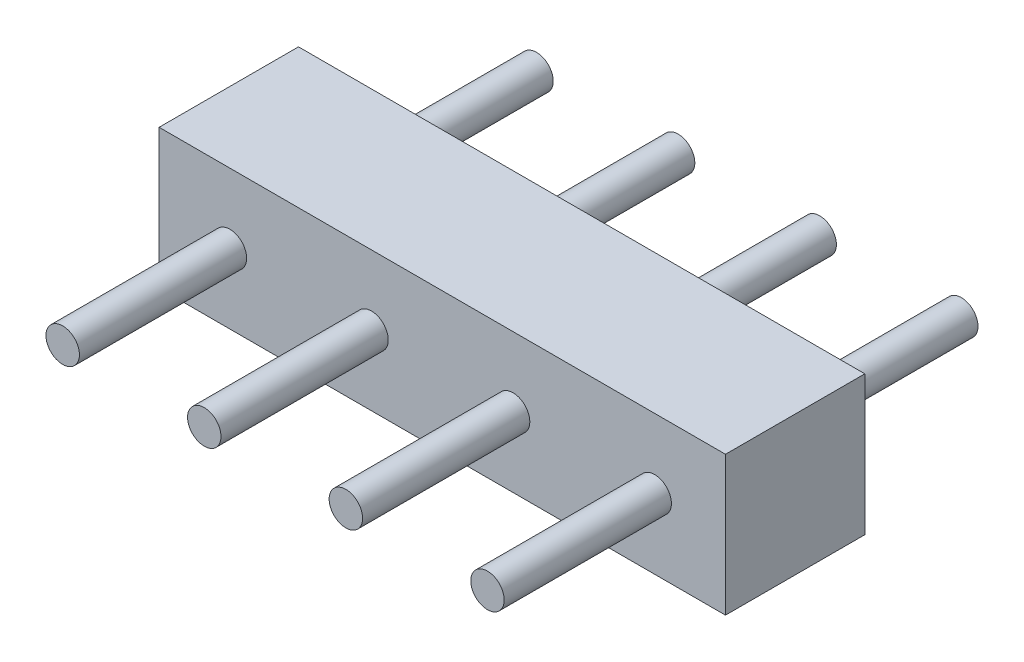
ISO-10303-21;
HEADER;
FILE_DESCRIPTION(('STEP AP214'),'2;1');
FILE_NAME('part.step','',(''),(''),'','','');
FILE_SCHEMA(('AUTOMOTIVE_DESIGN { 1 0 10303 214 1 1 1 1 }'));
ENDSEC;
DATA;
#1=APPLICATION_CONTEXT('core data for automotive mechanical design processes');
#2=APPLICATION_PROTOCOL_DEFINITION('international standard','automotive_design',2000,#1);
#3=PRODUCT_CONTEXT('',#1,'mechanical');
#4=PRODUCT('Part','Part','',(#3));
#5=PRODUCT_RELATED_PRODUCT_CATEGORY('part','',(#4));
#6=PRODUCT_DEFINITION_FORMATION('','',#4);
#7=PRODUCT_DEFINITION_CONTEXT('part definition',#1,'design');
#8=PRODUCT_DEFINITION('design','',#6,#7);
#9=PRODUCT_DEFINITION_SHAPE('','',#8);
#10=(LENGTH_UNIT() NAMED_UNIT(*) SI_UNIT(.MILLI.,.METRE.));
#11=(NAMED_UNIT(*) PLANE_ANGLE_UNIT() SI_UNIT($,.RADIAN.));
#12=(NAMED_UNIT(*) SI_UNIT($,.STERADIAN.) SOLID_ANGLE_UNIT());
#13=UNCERTAINTY_MEASURE_WITH_UNIT(LENGTH_MEASURE(1.E-05),#10,'distance_accuracy_value','');
#14=(GEOMETRIC_REPRESENTATION_CONTEXT(3) GLOBAL_UNCERTAINTY_ASSIGNED_CONTEXT((#13)) GLOBAL_UNIT_ASSIGNED_CONTEXT((#10,
#11,#12)) REPRESENTATION_CONTEXT('',''));
#15=CARTESIAN_POINT('',(0.,0.,0.));
#16=DIRECTION('',(0.,0.,1.));
#17=DIRECTION('',(1.,0.,0.));
#18=AXIS2_PLACEMENT_3D('',#15,#16,#17);
#19=CARTESIAN_POINT('',(0.,0.,2.5));
#20=DIRECTION('',(1.,0.,0.));
#21=DIRECTION('',(0.,0.,-1.));
#22=AXIS2_PLACEMENT_3D('',#19,#20,#21);
#23=PLANE('',#22);
#24=DIRECTION('',(0.,-1.,0.));
#25=VECTOR('',#24,1.);
#26=CARTESIAN_POINT('',(0.,0.,0.));
#27=LINE('',#26,#25);
#28=CARTESIAN_POINT('',(0.,2.5,0.));
#29=VERTEX_POINT('',#28);
#30=CARTESIAN_POINT('',(0.,0.,0.));
#31=VERTEX_POINT('',#30);
#32=EDGE_CURVE('E104',#29,#31,#27,.T.);
#33=ORIENTED_EDGE('',*,*,#32,.T.);
#34=DIRECTION('',(0.,0.,-1.));
#35=VECTOR('',#34,1.);
#36=CARTESIAN_POINT('',(0.,0.,2.5));
#37=LINE('',#36,#35);
#38=CARTESIAN_POINT('',(0.,0.,2.5));
#39=VERTEX_POINT('',#38);
#40=EDGE_CURVE('E95',#39,#31,#37,.T.);
#41=ORIENTED_EDGE('',*,*,#40,.F.);
#42=DIRECTION('',(0.,-1.,0.));
#43=VECTOR('',#42,1.);
#44=CARTESIAN_POINT('',(0.,0.,2.5));
#45=LINE('',#44,#43);
#46=CARTESIAN_POINT('',(0.,2.5,2.5));
#47=VERTEX_POINT('',#46);
#48=EDGE_CURVE('E89',#47,#39,#45,.T.);
#49=ORIENTED_EDGE('',*,*,#48,.F.);
#50=DIRECTION('',(0.,0.,-1.));
#51=VECTOR('',#50,1.);
#52=CARTESIAN_POINT('',(0.,2.5,2.5));
#53=LINE('',#52,#51);
#54=EDGE_CURVE('E100',#47,#29,#53,.T.);
#55=ORIENTED_EDGE('',*,*,#54,.T.);
#56=EDGE_LOOP('',(#33,#41,#49,#55));
#57=FACE_BOUND('',#56,.T.);
#58=ADVANCED_FACE('F37',(#57),#23,.F.);
#59=CARTESIAN_POINT('',(0.,0.,2.5));
#60=DIRECTION('',(0.,1.,0.));
#61=DIRECTION('',(0.,0.,1.));
#62=AXIS2_PLACEMENT_3D('',#59,#60,#61);
#63=PLANE('',#62);
#64=DIRECTION('',(1.,0.,0.));
#65=VECTOR('',#64,1.);
#66=CARTESIAN_POINT('',(0.,0.,0.));
#67=LINE('',#66,#65);
#68=CARTESIAN_POINT('',(10.16,0.,0.));
#69=VERTEX_POINT('',#68);
#70=EDGE_CURVE('E94',#31,#69,#67,.T.);
#71=ORIENTED_EDGE('',*,*,#70,.T.);
#72=DIRECTION('',(0.,0.,-1.));
#73=VECTOR('',#72,1.);
#74=CARTESIAN_POINT('',(10.16,0.,2.5));
#75=LINE('',#74,#73);
#76=CARTESIAN_POINT('',(10.16,0.,2.5));
#77=VERTEX_POINT('',#76);
#78=EDGE_CURVE('E92',#77,#69,#75,.T.);
#79=ORIENTED_EDGE('',*,*,#78,.F.);
#80=DIRECTION('',(1.,0.,0.));
#81=VECTOR('',#80,1.);
#82=CARTESIAN_POINT('',(0.,0.,2.5));
#83=LINE('',#82,#81);
#84=EDGE_CURVE('E84',#39,#77,#83,.T.);
#85=ORIENTED_EDGE('',*,*,#84,.F.);
#86=ORIENTED_EDGE('',*,*,#40,.T.);
#87=EDGE_LOOP('',(#71,#79,#85,#86));
#88=FACE_BOUND('',#87,.T.);
#89=ADVANCED_FACE('F93',(#88),#63,.F.);
#90=CARTESIAN_POINT('',(10.16,0.,2.5));
#91=DIRECTION('',(-1.,0.,0.));
#92=DIRECTION('',(0.,0.,1.));
#93=AXIS2_PLACEMENT_3D('',#90,#91,#92);
#94=PLANE('',#93);
#95=DIRECTION('',(0.,1.,0.));
#96=VECTOR('',#95,1.);
#97=CARTESIAN_POINT('',(10.16,0.,0.));
#98=LINE('',#97,#96);
#99=CARTESIAN_POINT('',(10.16,2.5,0.));
#100=VERTEX_POINT('',#99);
#101=EDGE_CURVE('E70',#69,#100,#98,.T.);
#102=ORIENTED_EDGE('',*,*,#101,.T.);
#103=DIRECTION('',(0.,0.,-1.));
#104=VECTOR('',#103,1.);
#105=CARTESIAN_POINT('',(10.16,2.5,2.5));
#106=LINE('',#105,#104);
#107=CARTESIAN_POINT('',(10.16,2.5,2.5));
#108=VERTEX_POINT('',#107);
#109=EDGE_CURVE('E96',#108,#100,#106,.T.);
#110=ORIENTED_EDGE('',*,*,#109,.F.);
#111=DIRECTION('',(0.,1.,0.));
#112=VECTOR('',#111,1.);
#113=CARTESIAN_POINT('',(10.16,0.,2.5));
#114=LINE('',#113,#112);
#115=EDGE_CURVE('E87',#77,#108,#114,.T.);
#116=ORIENTED_EDGE('',*,*,#115,.F.);
#117=ORIENTED_EDGE('',*,*,#78,.T.);
#118=EDGE_LOOP('',(#102,#110,#116,#117));
#119=FACE_BOUND('',#118,.T.);
#120=ADVANCED_FACE('F98',(#119),#94,.F.);
#121=CARTESIAN_POINT('',(0.,2.5,2.5));
#122=DIRECTION('',(0.,-1.,0.));
#123=DIRECTION('',(0.,0.,-1.));
#124=AXIS2_PLACEMENT_3D('',#121,#122,#123);
#125=PLANE('',#124);
#126=DIRECTION('',(-1.,0.,0.));
#127=VECTOR('',#126,1.);
#128=CARTESIAN_POINT('',(0.,2.5,0.));
#129=LINE('',#128,#127);
#130=EDGE_CURVE('E76',#100,#29,#129,.T.);
#131=ORIENTED_EDGE('',*,*,#130,.T.);
#132=ORIENTED_EDGE('',*,*,#54,.F.);
#133=DIRECTION('',(-1.,0.,0.));
#134=VECTOR('',#133,1.);
#135=CARTESIAN_POINT('',(0.,2.5,2.5));
#136=LINE('',#135,#134);
#137=EDGE_CURVE('E53',#108,#47,#136,.T.);
#138=ORIENTED_EDGE('',*,*,#137,.F.);
#139=ORIENTED_EDGE('',*,*,#109,.T.);
#140=EDGE_LOOP('',(#131,#132,#138,#139));
#141=FACE_BOUND('',#140,.T.);
#142=ADVANCED_FACE('F137',(#141),#125,.F.);
#143=CARTESIAN_POINT('',(0.,0.,2.5));
#144=DIRECTION('',(0.,0.,-1.));
#145=DIRECTION('',(-1.,0.,0.));
#146=AXIS2_PLACEMENT_3D('',#143,#144,#145);
#147=PLANE('',#146);
#148=CARTESIAN_POINT('',(8.89,1.25,2.5));
#149=DIRECTION('',(0.,0.,-1.));
#150=DIRECTION('',(-1.,0.,0.));
#151=AXIS2_PLACEMENT_3D('',#148,#149,#150);
#152=CIRCLE('',#151,0.3);
#153=CARTESIAN_POINT('',(8.59,1.25,2.5));
#154=VERTEX_POINT('',#153);
#155=EDGE_CURVE('E336',#154,#154,#152,.T.);
#156=ORIENTED_EDGE('',*,*,#155,.T.);
#157=EDGE_LOOP('',(#156));
#158=FACE_BOUND('',#157,.T.);
#159=CARTESIAN_POINT('',(6.35,1.25,2.5));
#160=DIRECTION('',(0.,0.,-1.));
#161=DIRECTION('',(-1.,0.,0.));
#162=AXIS2_PLACEMENT_3D('',#159,#160,#161);
#163=CIRCLE('',#162,0.3);
#164=CARTESIAN_POINT('',(6.05,1.25,2.5));
#165=VERTEX_POINT('',#164);
#166=EDGE_CURVE('E347',#165,#165,#163,.T.);
#167=ORIENTED_EDGE('',*,*,#166,.T.);
#168=EDGE_LOOP('',(#167));
#169=FACE_BOUND('',#168,.T.);
#170=CARTESIAN_POINT('',(1.27,1.25,2.5));
#171=DIRECTION('',(0.,0.,-1.));
#172=DIRECTION('',(-1.,0.,0.));
#173=AXIS2_PLACEMENT_3D('',#170,#171,#172);
#174=CIRCLE('',#173,0.3);
#175=CARTESIAN_POINT('',(0.970000000000001,1.25,2.5));
#176=VERTEX_POINT('',#175);
#177=EDGE_CURVE('E356',#176,#176,#174,.T.);
#178=ORIENTED_EDGE('',*,*,#177,.T.);
#179=EDGE_LOOP('',(#178));
#180=FACE_BOUND('',#179,.T.);
#181=CARTESIAN_POINT('',(3.81,1.25,2.5));
#182=DIRECTION('',(0.,0.,-1.));
#183=DIRECTION('',(-1.,0.,0.));
#184=AXIS2_PLACEMENT_3D('',#181,#182,#183);
#185=CIRCLE('',#184,0.3);
#186=CARTESIAN_POINT('',(3.51,1.25,2.5));
#187=VERTEX_POINT('',#186);
#188=EDGE_CURVE('E107',#187,#187,#185,.T.);
#189=ORIENTED_EDGE('',*,*,#188,.T.);
#190=EDGE_LOOP('',(#189));
#191=FACE_BOUND('',#190,.T.);
#192=ORIENTED_EDGE('',*,*,#48,.T.);
#193=ORIENTED_EDGE('',*,*,#84,.T.);
#194=ORIENTED_EDGE('',*,*,#115,.T.);
#195=ORIENTED_EDGE('',*,*,#137,.T.);
#196=EDGE_LOOP('',(#192,#193,#194,#195));
#197=FACE_BOUND('',#196,.T.);
#198=ADVANCED_FACE('F85',(#158,#169,#180,#191,#197),#147,.F.);
#199=CARTESIAN_POINT('',(0.,0.,0.));
#200=DIRECTION('',(0.,0.,-1.));
#201=DIRECTION('',(-1.,0.,0.));
#202=AXIS2_PLACEMENT_3D('',#199,#200,#201);
#203=PLANE('',#202);
#204=CARTESIAN_POINT('',(8.89,1.25,0.));
#205=DIRECTION('',(0.,0.,-1.));
#206=DIRECTION('',(-1.,0.,0.));
#207=AXIS2_PLACEMENT_3D('',#204,#205,#206);
#208=CIRCLE('',#207,0.3);
#209=CARTESIAN_POINT('',(8.59,1.25,0.));
#210=VERTEX_POINT('',#209);
#211=EDGE_CURVE('E11',#210,#210,#208,.T.);
#212=ORIENTED_EDGE('',*,*,#211,.F.);
#213=EDGE_LOOP('',(#212));
#214=FACE_BOUND('',#213,.T.);
#215=CARTESIAN_POINT('',(6.35,1.25,0.));
#216=DIRECTION('',(0.,0.,-1.));
#217=DIRECTION('',(-1.,0.,0.));
#218=AXIS2_PLACEMENT_3D('',#215,#216,#217);
#219=CIRCLE('',#218,0.3);
#220=CARTESIAN_POINT('',(6.05,1.25,0.));
#221=VERTEX_POINT('',#220);
#222=EDGE_CURVE('E45',#221,#221,#219,.T.);
#223=ORIENTED_EDGE('',*,*,#222,.F.);
#224=EDGE_LOOP('',(#223));
#225=FACE_BOUND('',#224,.T.);
#226=CARTESIAN_POINT('',(1.27,1.25,0.));
#227=DIRECTION('',(0.,0.,-1.));
#228=DIRECTION('',(-1.,0.,0.));
#229=AXIS2_PLACEMENT_3D('',#226,#227,#228);
#230=CIRCLE('',#229,0.3);
#231=CARTESIAN_POINT('',(0.970000000000001,1.25,0.));
#232=VERTEX_POINT('',#231);
#233=EDGE_CURVE('E117',#232,#232,#230,.T.);
#234=ORIENTED_EDGE('',*,*,#233,.F.);
#235=EDGE_LOOP('',(#234));
#236=FACE_BOUND('',#235,.T.);
#237=CARTESIAN_POINT('',(3.81,1.25,0.));
#238=DIRECTION('',(0.,0.,-1.));
#239=DIRECTION('',(-1.,0.,0.));
#240=AXIS2_PLACEMENT_3D('',#237,#238,#239);
#241=CIRCLE('',#240,0.3);
#242=CARTESIAN_POINT('',(3.51,1.25,0.));
#243=VERTEX_POINT('',#242);
#244=EDGE_CURVE('E114',#243,#243,#241,.T.);
#245=ORIENTED_EDGE('',*,*,#244,.F.);
#246=EDGE_LOOP('',(#245));
#247=FACE_BOUND('',#246,.T.);
#248=ORIENTED_EDGE('',*,*,#32,.F.);
#249=ORIENTED_EDGE('',*,*,#130,.F.);
#250=ORIENTED_EDGE('',*,*,#101,.F.);
#251=ORIENTED_EDGE('',*,*,#70,.F.);
#252=EDGE_LOOP('',(#248,#249,#250,#251));
#253=FACE_BOUND('',#252,.T.);
#254=ADVANCED_FACE('F125',(#214,#225,#236,#247,#253),#203,.T.);
#255=CARTESIAN_POINT('',(3.81,1.25,-3.));
#256=DIRECTION('',(0.,0.,1.));
#257=DIRECTION('',(1.,0.,0.));
#258=AXIS2_PLACEMENT_3D('',#255,#256,#257);
#259=PLANE('',#258);
#260=CARTESIAN_POINT('',(3.81,1.25,-3.));
#261=DIRECTION('',(0.,0.,1.));
#262=DIRECTION('',(1.,0.,0.));
#263=AXIS2_PLACEMENT_3D('',#260,#261,#262);
#264=CIRCLE('',#263,0.3);
#265=CARTESIAN_POINT('',(4.11,1.25,-3.));
#266=VERTEX_POINT('',#265);
#267=EDGE_CURVE('E362',#266,#266,#264,.T.);
#268=ORIENTED_EDGE('',*,*,#267,.F.);
#269=EDGE_LOOP('',(#268));
#270=FACE_BOUND('',#269,.T.);
#271=ADVANCED_FACE('F128',(#270),#259,.F.);
#272=CARTESIAN_POINT('',(3.81,1.25,-3.));
#273=DIRECTION('',(0.,0.,1.));
#274=DIRECTION('',(1.,0.,0.));
#275=AXIS2_PLACEMENT_3D('',#272,#273,#274);
#276=CYLINDRICAL_SURFACE('',#275,0.3);
#277=ORIENTED_EDGE('',*,*,#244,.T.);
#278=EDGE_LOOP('',(#277));
#279=FACE_BOUND('',#278,.T.);
#280=ORIENTED_EDGE('',*,*,#267,.T.);
#281=EDGE_LOOP('',(#280));
#282=FACE_BOUND('',#281,.T.);
#283=ADVANCED_FACE('F171',(#279,#282),#276,.T.);
#284=CARTESIAN_POINT('',(3.81,1.25,5.5));
#285=DIRECTION('',(0.,0.,1.));
#286=DIRECTION('',(1.,0.,0.));
#287=AXIS2_PLACEMENT_3D('',#284,#285,#286);
#288=CIRCLE('',#287,0.3);
#289=CARTESIAN_POINT('',(4.11,1.25,5.5));
#290=VERTEX_POINT('',#289);
#291=EDGE_CURVE('E359',#290,#290,#288,.T.);
#292=ORIENTED_EDGE('',*,*,#291,.F.);
#293=EDGE_LOOP('',(#292));
#294=FACE_BOUND('',#293,.T.);
#295=ORIENTED_EDGE('',*,*,#188,.F.);
#296=EDGE_LOOP('',(#295));
#297=FACE_BOUND('',#296,.T.);
#298=ADVANCED_FACE('F182',(#294,#297),#276,.T.);
#299=CARTESIAN_POINT('',(3.81,1.25,5.5));
#300=DIRECTION('',(0.,0.,1.));
#301=DIRECTION('',(1.,0.,0.));
#302=AXIS2_PLACEMENT_3D('',#299,#300,#301);
#303=PLANE('',#302);
#304=ORIENTED_EDGE('',*,*,#291,.T.);
#305=EDGE_LOOP('',(#304));
#306=FACE_BOUND('',#305,.T.);
#307=ADVANCED_FACE('F192',(#306),#303,.T.);
#308=CARTESIAN_POINT('',(1.27,1.25,-3.));
#309=DIRECTION('',(0.,0.,1.));
#310=DIRECTION('',(1.,0.,0.));
#311=AXIS2_PLACEMENT_3D('',#308,#309,#310);
#312=PLANE('',#311);
#313=CARTESIAN_POINT('',(1.27,1.25,-3.));
#314=DIRECTION('',(0.,0.,1.));
#315=DIRECTION('',(1.,0.,0.));
#316=AXIS2_PLACEMENT_3D('',#313,#314,#315);
#317=CIRCLE('',#316,0.3);
#318=CARTESIAN_POINT('',(1.57,1.25,-3.));
#319=VERTEX_POINT('',#318);
#320=EDGE_CURVE('E353',#319,#319,#317,.T.);
#321=ORIENTED_EDGE('',*,*,#320,.F.);
#322=EDGE_LOOP('',(#321));
#323=FACE_BOUND('',#322,.T.);
#324=ADVANCED_FACE('F201',(#323),#312,.F.);
#325=CARTESIAN_POINT('',(1.27,1.25,-3.));
#326=DIRECTION('',(0.,0.,1.));
#327=DIRECTION('',(1.,0.,0.));
#328=AXIS2_PLACEMENT_3D('',#325,#326,#327);
#329=CYLINDRICAL_SURFACE('',#328,0.3);
#330=ORIENTED_EDGE('',*,*,#233,.T.);
#331=EDGE_LOOP('',(#330));
#332=FACE_BOUND('',#331,.T.);
#333=ORIENTED_EDGE('',*,*,#320,.T.);
#334=EDGE_LOOP('',(#333));
#335=FACE_BOUND('',#334,.T.);
#336=ADVANCED_FACE('F221',(#332,#335),#329,.T.);
#337=CARTESIAN_POINT('',(1.27,1.25,5.5));
#338=DIRECTION('',(0.,0.,1.));
#339=DIRECTION('',(1.,0.,0.));
#340=AXIS2_PLACEMENT_3D('',#337,#338,#339);
#341=CIRCLE('',#340,0.3);
#342=CARTESIAN_POINT('',(1.57,1.25,5.5));
#343=VERTEX_POINT('',#342);
#344=EDGE_CURVE('E350',#343,#343,#341,.T.);
#345=ORIENTED_EDGE('',*,*,#344,.F.);
#346=EDGE_LOOP('',(#345));
#347=FACE_BOUND('',#346,.T.);
#348=ORIENTED_EDGE('',*,*,#177,.F.);
#349=EDGE_LOOP('',(#348));
#350=FACE_BOUND('',#349,.T.);
#351=ADVANCED_FACE('F231',(#347,#350),#329,.T.);
#352=CARTESIAN_POINT('',(1.27,1.25,5.5));
#353=DIRECTION('',(0.,0.,1.));
#354=DIRECTION('',(1.,0.,0.));
#355=AXIS2_PLACEMENT_3D('',#352,#353,#354);
#356=PLANE('',#355);
#357=ORIENTED_EDGE('',*,*,#344,.T.);
#358=EDGE_LOOP('',(#357));
#359=FACE_BOUND('',#358,.T.);
#360=ADVANCED_FACE('F241',(#359),#356,.T.);
#361=CARTESIAN_POINT('',(6.35,1.25,-3.));
#362=DIRECTION('',(0.,0.,1.));
#363=DIRECTION('',(1.,0.,0.));
#364=AXIS2_PLACEMENT_3D('',#361,#362,#363);
#365=PLANE('',#364);
#366=CARTESIAN_POINT('',(6.35,1.25,-3.));
#367=DIRECTION('',(0.,0.,1.));
#368=DIRECTION('',(1.,0.,0.));
#369=AXIS2_PLACEMENT_3D('',#366,#367,#368);
#370=CIRCLE('',#369,0.3);
#371=CARTESIAN_POINT('',(6.65,1.25,-3.));
#372=VERTEX_POINT('',#371);
#373=EDGE_CURVE('E344',#372,#372,#370,.T.);
#374=ORIENTED_EDGE('',*,*,#373,.F.);
#375=EDGE_LOOP('',(#374));
#376=FACE_BOUND('',#375,.T.);
#377=ADVANCED_FACE('F250',(#376),#365,.F.);
#378=CARTESIAN_POINT('',(6.35,1.25,-3.));
#379=DIRECTION('',(0.,0.,1.));
#380=DIRECTION('',(1.,0.,0.));
#381=AXIS2_PLACEMENT_3D('',#378,#379,#380);
#382=CYLINDRICAL_SURFACE('',#381,0.3);
#383=ORIENTED_EDGE('',*,*,#222,.T.);
#384=EDGE_LOOP('',(#383));
#385=FACE_BOUND('',#384,.T.);
#386=ORIENTED_EDGE('',*,*,#373,.T.);
#387=EDGE_LOOP('',(#386));
#388=FACE_BOUND('',#387,.T.);
#389=ADVANCED_FACE('F122',(#385,#388),#382,.T.);
#390=CARTESIAN_POINT('',(6.35,1.25,5.5));
#391=DIRECTION('',(0.,0.,1.));
#392=DIRECTION('',(1.,0.,0.));
#393=AXIS2_PLACEMENT_3D('',#390,#391,#392);
#394=CIRCLE('',#393,0.3);
#395=CARTESIAN_POINT('',(6.65,1.25,5.5));
#396=VERTEX_POINT('',#395);
#397=EDGE_CURVE('E341',#396,#396,#394,.T.);
#398=ORIENTED_EDGE('',*,*,#397,.F.);
#399=EDGE_LOOP('',(#398));
#400=FACE_BOUND('',#399,.T.);
#401=ORIENTED_EDGE('',*,*,#166,.F.);
#402=EDGE_LOOP('',(#401));
#403=FACE_BOUND('',#402,.T.);
#404=ADVANCED_FACE('F269',(#400,#403),#382,.T.);
#405=CARTESIAN_POINT('',(6.35,1.25,5.5));
#406=DIRECTION('',(0.,0.,1.));
#407=DIRECTION('',(1.,0.,0.));
#408=AXIS2_PLACEMENT_3D('',#405,#406,#407);
#409=PLANE('',#408);
#410=ORIENTED_EDGE('',*,*,#397,.T.);
#411=EDGE_LOOP('',(#410));
#412=FACE_BOUND('',#411,.T.);
#413=ADVANCED_FACE('F278',(#412),#409,.T.);
#414=CARTESIAN_POINT('',(8.89,1.25,-3.));
#415=DIRECTION('',(0.,0.,1.));
#416=DIRECTION('',(1.,0.,0.));
#417=AXIS2_PLACEMENT_3D('',#414,#415,#416);
#418=PLANE('',#417);
#419=CARTESIAN_POINT('',(8.89,1.25,-3.));
#420=DIRECTION('',(0.,0.,1.));
#421=DIRECTION('',(1.,0.,0.));
#422=AXIS2_PLACEMENT_3D('',#419,#420,#421);
#423=CIRCLE('',#422,0.3);
#424=CARTESIAN_POINT('',(9.19,1.25,-3.));
#425=VERTEX_POINT('',#424);
#426=EDGE_CURVE('E333',#425,#425,#423,.T.);
#427=ORIENTED_EDGE('',*,*,#426,.F.);
#428=EDGE_LOOP('',(#427));
#429=FACE_BOUND('',#428,.T.);
#430=ADVANCED_FACE('F287',(#429),#418,.F.);
#431=CARTESIAN_POINT('',(8.89,1.25,-3.));
#432=DIRECTION('',(0.,0.,1.));
#433=DIRECTION('',(1.,0.,0.));
#434=AXIS2_PLACEMENT_3D('',#431,#432,#433);
#435=CYLINDRICAL_SURFACE('',#434,0.3);
#436=ORIENTED_EDGE('',*,*,#211,.T.);
#437=EDGE_LOOP('',(#436));
#438=FACE_BOUND('',#437,.T.);
#439=ORIENTED_EDGE('',*,*,#426,.T.);
#440=EDGE_LOOP('',(#439));
#441=FACE_BOUND('',#440,.T.);
#442=ADVANCED_FACE('F297',(#438,#441),#435,.T.);
#443=CARTESIAN_POINT('',(8.89,1.25,5.5));
#444=DIRECTION('',(0.,0.,1.));
#445=DIRECTION('',(1.,0.,0.));
#446=AXIS2_PLACEMENT_3D('',#443,#444,#445);
#447=CIRCLE('',#446,0.3);
#448=CARTESIAN_POINT('',(9.19,1.25,5.5));
#449=VERTEX_POINT('',#448);
#450=EDGE_CURVE('E332',#449,#449,#447,.T.);
#451=ORIENTED_EDGE('',*,*,#450,.F.);
#452=EDGE_LOOP('',(#451));
#453=FACE_BOUND('',#452,.T.);
#454=ORIENTED_EDGE('',*,*,#155,.F.);
#455=EDGE_LOOP('',(#454));
#456=FACE_BOUND('',#455,.T.);
#457=ADVANCED_FACE('F307',(#453,#456),#435,.T.);
#458=CARTESIAN_POINT('',(8.89,1.25,5.5));
#459=DIRECTION('',(0.,0.,1.));
#460=DIRECTION('',(1.,0.,0.));
#461=AXIS2_PLACEMENT_3D('',#458,#459,#460);
#462=PLANE('',#461);
#463=ORIENTED_EDGE('',*,*,#450,.T.);
#464=EDGE_LOOP('',(#463));
#465=FACE_BOUND('',#464,.T.);
#466=ADVANCED_FACE('F317',(#465),#462,.T.);
#467=CLOSED_SHELL('',(#58,#89,#120,#142,#198,#254,#271,#283,#298,#307,#324,#336,#351,#360,#377,
#389,#404,#413,#430,#442,#457,#466));
#468=MANIFOLD_SOLID_BREP('B2',#467);
#469=ADVANCED_BREP_SHAPE_REPRESENTATION('',(#18,#468),#14);
#470=SHAPE_DEFINITION_REPRESENTATION(#9,#469);
ENDSEC;
END-ISO-10303-21;
